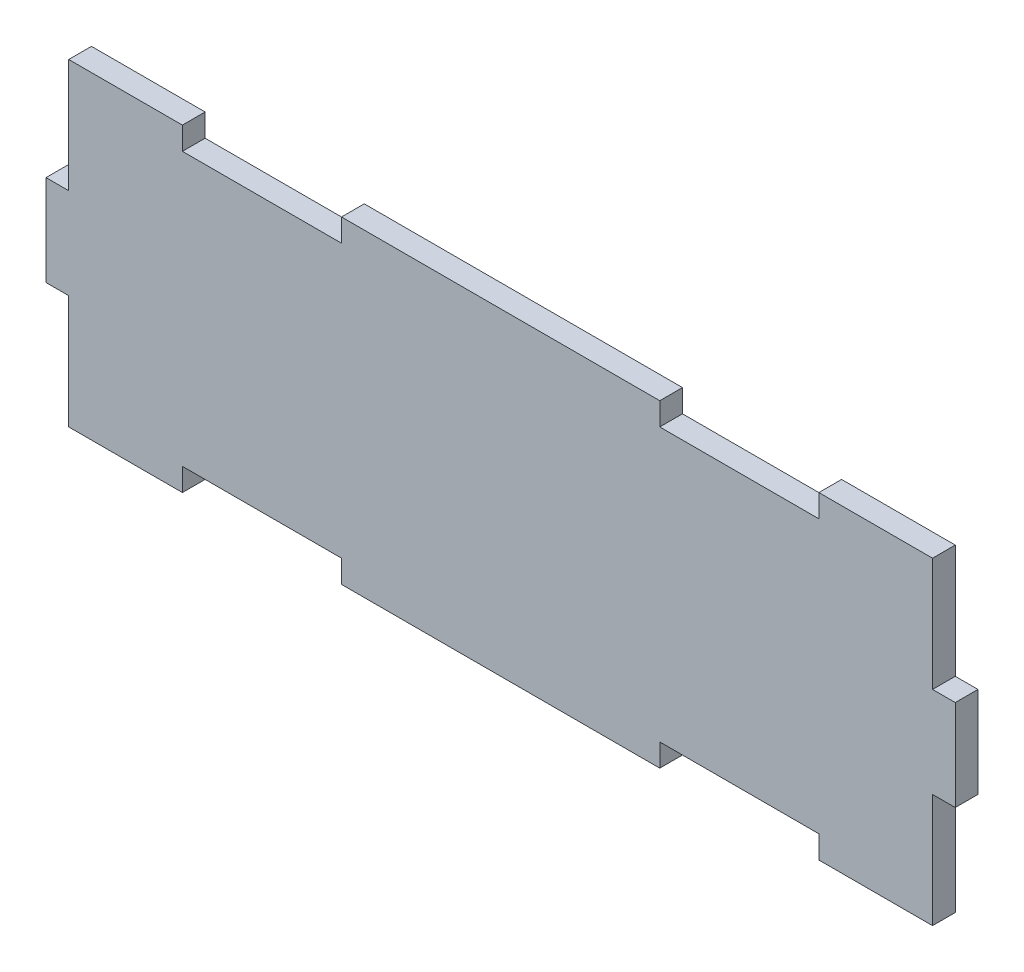
ISO-10303-21;
HEADER;
FILE_DESCRIPTION(('STEP AP214'),'2;1');
FILE_NAME('part.step','',(''),(''),'','','');
FILE_SCHEMA(('AUTOMOTIVE_DESIGN { 1 0 10303 214 1 1 1 1 }'));
ENDSEC;
DATA;
#1=APPLICATION_CONTEXT('core data for automotive mechanical design processes');
#2=APPLICATION_PROTOCOL_DEFINITION('international standard','automotive_design',2000,#1);
#3=PRODUCT_CONTEXT('',#1,'mechanical');
#4=PRODUCT('Part','Part','',(#3));
#5=PRODUCT_RELATED_PRODUCT_CATEGORY('part','',(#4));
#6=PRODUCT_DEFINITION_FORMATION('','',#4);
#7=PRODUCT_DEFINITION_CONTEXT('part definition',#1,'design');
#8=PRODUCT_DEFINITION('design','',#6,#7);
#9=PRODUCT_DEFINITION_SHAPE('','',#8);
#10=(LENGTH_UNIT() NAMED_UNIT(*) SI_UNIT(.MILLI.,.METRE.));
#11=(NAMED_UNIT(*) PLANE_ANGLE_UNIT() SI_UNIT($,.RADIAN.));
#12=(NAMED_UNIT(*) SI_UNIT($,.STERADIAN.) SOLID_ANGLE_UNIT());
#13=UNCERTAINTY_MEASURE_WITH_UNIT(LENGTH_MEASURE(1.E-05),#10,'distance_accuracy_value','');
#14=(GEOMETRIC_REPRESENTATION_CONTEXT(3) GLOBAL_UNCERTAINTY_ASSIGNED_CONTEXT((#13)) GLOBAL_UNIT_ASSIGNED_CONTEXT((#10,
#11,#12)) REPRESENTATION_CONTEXT('',''));
#15=CARTESIAN_POINT('',(0.,0.,0.));
#16=DIRECTION('',(0.,0.,1.));
#17=DIRECTION('',(1.,0.,0.));
#18=AXIS2_PLACEMENT_3D('',#15,#16,#17);
#19=CARTESIAN_POINT('',(21.953781512605,55.6932773109244,5.));
#20=DIRECTION('',(-1.,0.,0.));
#21=DIRECTION('',(0.,0.,1.));
#22=AXIS2_PLACEMENT_3D('',#19,#20,#21);
#23=PLANE('',#22);
#24=DIRECTION('',(0.,1.,0.));
#25=VECTOR('',#24,1.);
#26=CARTESIAN_POINT('',(21.953781512605,55.6932773109244,0.));
#27=LINE('',#26,#25);
#28=CARTESIAN_POINT('',(21.953781512605,50.6932773109244,0.));
#29=VERTEX_POINT('',#28);
#30=CARTESIAN_POINT('',(21.953781512605,55.6932773109244,0.));
#31=VERTEX_POINT('',#30);
#32=EDGE_CURVE('E248',#29,#31,#27,.T.);
#33=ORIENTED_EDGE('',*,*,#32,.T.);
#34=DIRECTION('',(0.,0.,-1.));
#35=VECTOR('',#34,1.);
#36=CARTESIAN_POINT('',(21.953781512605,55.6932773109244,5.));
#37=LINE('',#36,#35);
#38=CARTESIAN_POINT('',(21.953781512605,55.6932773109244,5.));
#39=VERTEX_POINT('',#38);
#40=EDGE_CURVE('E11',#39,#31,#37,.T.);
#41=ORIENTED_EDGE('',*,*,#40,.F.);
#42=DIRECTION('',(0.,1.,0.));
#43=VECTOR('',#42,1.);
#44=CARTESIAN_POINT('',(21.953781512605,55.6932773109244,5.));
#45=LINE('',#44,#43);
#46=CARTESIAN_POINT('',(21.953781512605,50.6932773109244,5.));
#47=VERTEX_POINT('',#46);
#48=EDGE_CURVE('E302',#47,#39,#45,.T.);
#49=ORIENTED_EDGE('',*,*,#48,.F.);
#50=DIRECTION('',(0.,0.,-1.));
#51=VECTOR('',#50,1.);
#52=CARTESIAN_POINT('',(21.953781512605,50.6932773109244,5.));
#53=LINE('',#52,#51);
#54=EDGE_CURVE('E244',#47,#29,#53,.T.);
#55=ORIENTED_EDGE('',*,*,#54,.T.);
#56=EDGE_LOOP('',(#33,#41,#49,#55));
#57=FACE_BOUND('',#56,.T.);
#58=ADVANCED_FACE('F32',(#57),#23,.F.);
#59=CARTESIAN_POINT('',(-48.046218487395,55.6932773109244,5.));
#60=DIRECTION('',(0.,-1.,0.));
#61=DIRECTION('',(0.,0.,-1.));
#62=AXIS2_PLACEMENT_3D('',#59,#60,#61);
#63=PLANE('',#62);
#64=DIRECTION('',(-1.,0.,0.));
#65=VECTOR('',#64,1.);
#66=CARTESIAN_POINT('',(-48.046218487395,55.6932773109244,0.));
#67=LINE('',#66,#65);
#68=CARTESIAN_POINT('',(-48.046218487395,55.6932773109244,0.));
#69=VERTEX_POINT('',#68);
#70=EDGE_CURVE('E251',#31,#69,#67,.T.);
#71=ORIENTED_EDGE('',*,*,#70,.T.);
#72=DIRECTION('',(0.,0.,-1.));
#73=VECTOR('',#72,1.);
#74=CARTESIAN_POINT('',(-48.046218487395,55.6932773109244,5.));
#75=LINE('',#74,#73);
#76=CARTESIAN_POINT('',(-48.046218487395,55.6932773109244,5.));
#77=VERTEX_POINT('',#76);
#78=EDGE_CURVE('E40',#77,#69,#75,.T.);
#79=ORIENTED_EDGE('',*,*,#78,.F.);
#80=DIRECTION('',(-1.,0.,0.));
#81=VECTOR('',#80,1.);
#82=CARTESIAN_POINT('',(-48.046218487395,55.6932773109244,5.));
#83=LINE('',#82,#81);
#84=EDGE_CURVE('E151',#39,#77,#83,.T.);
#85=ORIENTED_EDGE('',*,*,#84,.F.);
#86=ORIENTED_EDGE('',*,*,#40,.T.);
#87=EDGE_LOOP('',(#71,#79,#85,#86));
#88=FACE_BOUND('',#87,.T.);
#89=ADVANCED_FACE('F460',(#88),#63,.F.);
#90=CARTESIAN_POINT('',(-48.046218487395,55.6932773109244,5.));
#91=DIRECTION('',(1.,0.,0.));
#92=DIRECTION('',(0.,0.,-1.));
#93=AXIS2_PLACEMENT_3D('',#90,#91,#92);
#94=PLANE('',#93);
#95=DIRECTION('',(0.,-1.,0.));
#96=VECTOR('',#95,1.);
#97=CARTESIAN_POINT('',(-48.046218487395,55.6932773109244,0.));
#98=LINE('',#97,#96);
#99=CARTESIAN_POINT('',(-48.046218487395,50.6932773109244,0.));
#100=VERTEX_POINT('',#99);
#101=EDGE_CURVE('E253',#69,#100,#98,.T.);
#102=ORIENTED_EDGE('',*,*,#101,.T.);
#103=DIRECTION('',(0.,0.,-1.));
#104=VECTOR('',#103,1.);
#105=CARTESIAN_POINT('',(-48.046218487395,50.6932773109244,5.));
#106=LINE('',#105,#104);
#107=CARTESIAN_POINT('',(-48.046218487395,50.6932773109244,5.));
#108=VERTEX_POINT('',#107);
#109=EDGE_CURVE('E369',#108,#100,#106,.T.);
#110=ORIENTED_EDGE('',*,*,#109,.F.);
#111=DIRECTION('',(0.,-1.,0.));
#112=VECTOR('',#111,1.);
#113=CARTESIAN_POINT('',(-48.046218487395,55.6932773109244,5.));
#114=LINE('',#113,#112);
#115=EDGE_CURVE('E377',#77,#108,#114,.T.);
#116=ORIENTED_EDGE('',*,*,#115,.F.);
#117=ORIENTED_EDGE('',*,*,#78,.T.);
#118=EDGE_LOOP('',(#102,#110,#116,#117));
#119=FACE_BOUND('',#118,.T.);
#120=ADVANCED_FACE('F375',(#119),#94,.F.);
#121=CARTESIAN_POINT('',(-48.046218487395,50.6932773109244,5.));
#122=DIRECTION('',(0.,-1.,0.));
#123=DIRECTION('',(0.,0.,-1.));
#124=AXIS2_PLACEMENT_3D('',#121,#122,#123);
#125=PLANE('',#124);
#126=DIRECTION('',(-1.,0.,0.));
#127=VECTOR('',#126,1.);
#128=CARTESIAN_POINT('',(-48.046218487395,50.6932773109244,0.));
#129=LINE('',#128,#127);
#130=CARTESIAN_POINT('',(-83.046218487395,50.6932773109244,0.));
#131=VERTEX_POINT('',#130);
#132=EDGE_CURVE('E255',#100,#131,#129,.T.);
#133=ORIENTED_EDGE('',*,*,#132,.T.);
#134=DIRECTION('',(0.,0.,-1.));
#135=VECTOR('',#134,1.);
#136=CARTESIAN_POINT('',(-83.046218487395,50.6932773109244,5.));
#137=LINE('',#136,#135);
#138=CARTESIAN_POINT('',(-83.046218487395,50.6932773109244,5.));
#139=VERTEX_POINT('',#138);
#140=EDGE_CURVE('E366',#139,#131,#137,.T.);
#141=ORIENTED_EDGE('',*,*,#140,.F.);
#142=DIRECTION('',(-1.,0.,0.));
#143=VECTOR('',#142,1.);
#144=CARTESIAN_POINT('',(-48.046218487395,50.6932773109244,5.));
#145=LINE('',#144,#143);
#146=EDGE_CURVE('E395',#108,#139,#145,.T.);
#147=ORIENTED_EDGE('',*,*,#146,.F.);
#148=ORIENTED_EDGE('',*,*,#109,.T.);
#149=EDGE_LOOP('',(#133,#141,#147,#148));
#150=FACE_BOUND('',#149,.T.);
#151=ADVANCED_FACE('F386',(#150),#125,.F.);
#152=CARTESIAN_POINT('',(-83.046218487395,50.6932773109244,5.));
#153=DIRECTION('',(-1.,0.,0.));
#154=DIRECTION('',(0.,0.,1.));
#155=AXIS2_PLACEMENT_3D('',#152,#153,#154);
#156=PLANE('',#155);
#157=DIRECTION('',(0.,1.,0.));
#158=VECTOR('',#157,1.);
#159=CARTESIAN_POINT('',(-83.046218487395,50.6932773109244,0.));
#160=LINE('',#159,#158);
#161=CARTESIAN_POINT('',(-83.046218487395,55.6932773109244,0.));
#162=VERTEX_POINT('',#161);
#163=EDGE_CURVE('E257',#131,#162,#160,.T.);
#164=ORIENTED_EDGE('',*,*,#163,.T.);
#165=DIRECTION('',(0.,0.,-1.));
#166=VECTOR('',#165,1.);
#167=CARTESIAN_POINT('',(-83.046218487395,55.6932773109244,5.));
#168=LINE('',#167,#166);
#169=CARTESIAN_POINT('',(-83.046218487395,55.6932773109244,5.));
#170=VERTEX_POINT('',#169);
#171=EDGE_CURVE('E363',#170,#162,#168,.T.);
#172=ORIENTED_EDGE('',*,*,#171,.F.);
#173=DIRECTION('',(0.,1.,0.));
#174=VECTOR('',#173,1.);
#175=CARTESIAN_POINT('',(-83.046218487395,50.6932773109244,5.));
#176=LINE('',#175,#174);
#177=EDGE_CURVE('E392',#139,#170,#176,.T.);
#178=ORIENTED_EDGE('',*,*,#177,.F.);
#179=ORIENTED_EDGE('',*,*,#140,.T.);
#180=EDGE_LOOP('',(#164,#172,#178,#179));
#181=FACE_BOUND('',#180,.T.);
#182=ADVANCED_FACE('F390',(#181),#156,.F.);
#183=CARTESIAN_POINT('',(-83.046218487395,55.6932773109244,5.));
#184=DIRECTION('',(0.,-1.,0.));
#185=DIRECTION('',(0.,0.,-1.));
#186=AXIS2_PLACEMENT_3D('',#183,#184,#185);
#187=PLANE('',#186);
#188=DIRECTION('',(-1.,0.,0.));
#189=VECTOR('',#188,1.);
#190=CARTESIAN_POINT('',(-83.046218487395,55.6932773109244,0.));
#191=LINE('',#190,#189);
#192=CARTESIAN_POINT('',(-108.046218487395,55.6932773109244,0.));
#193=VERTEX_POINT('',#192);
#194=EDGE_CURVE('E259',#162,#193,#191,.T.);
#195=ORIENTED_EDGE('',*,*,#194,.T.);
#196=DIRECTION('',(0.,0.,-1.));
#197=VECTOR('',#196,1.);
#198=CARTESIAN_POINT('',(-108.046218487395,55.6932773109244,5.));
#199=LINE('',#198,#197);
#200=CARTESIAN_POINT('',(-108.046218487395,55.6932773109244,5.));
#201=VERTEX_POINT('',#200);
#202=EDGE_CURVE('E360',#201,#193,#199,.T.);
#203=ORIENTED_EDGE('',*,*,#202,.F.);
#204=DIRECTION('',(-1.,0.,0.));
#205=VECTOR('',#204,1.);
#206=CARTESIAN_POINT('',(-83.046218487395,55.6932773109244,5.));
#207=LINE('',#206,#205);
#208=EDGE_CURVE('E394',#170,#201,#207,.T.);
#209=ORIENTED_EDGE('',*,*,#208,.F.);
#210=ORIENTED_EDGE('',*,*,#171,.T.);
#211=EDGE_LOOP('',(#195,#203,#209,#210));
#212=FACE_BOUND('',#211,.T.);
#213=ADVANCED_FACE('F473',(#212),#187,.F.);
#214=CARTESIAN_POINT('',(-108.046218487395,55.6932773109244,5.));
#215=DIRECTION('',(1.,0.,0.));
#216=DIRECTION('',(0.,0.,-1.));
#217=AXIS2_PLACEMENT_3D('',#214,#215,#216);
#218=PLANE('',#217);
#219=DIRECTION('',(0.,-1.,0.));
#220=VECTOR('',#219,1.);
#221=CARTESIAN_POINT('',(-108.046218487395,55.6932773109244,0.));
#222=LINE('',#221,#220);
#223=CARTESIAN_POINT('',(-108.046218487395,30.6932773109244,0.));
#224=VERTEX_POINT('',#223);
#225=EDGE_CURVE('E261',#193,#224,#222,.T.);
#226=ORIENTED_EDGE('',*,*,#225,.T.);
#227=DIRECTION('',(0.,0.,-1.));
#228=VECTOR('',#227,1.);
#229=CARTESIAN_POINT('',(-108.046218487395,30.6932773109244,5.));
#230=LINE('',#229,#228);
#231=CARTESIAN_POINT('',(-108.046218487395,30.6932773109244,5.));
#232=VERTEX_POINT('',#231);
#233=EDGE_CURVE('E357',#232,#224,#230,.T.);
#234=ORIENTED_EDGE('',*,*,#233,.F.);
#235=DIRECTION('',(0.,-1.,0.));
#236=VECTOR('',#235,1.);
#237=CARTESIAN_POINT('',(-108.046218487395,55.6932773109244,5.));
#238=LINE('',#237,#236);
#239=EDGE_CURVE('E397',#201,#232,#238,.T.);
#240=ORIENTED_EDGE('',*,*,#239,.F.);
#241=ORIENTED_EDGE('',*,*,#202,.T.);
#242=EDGE_LOOP('',(#226,#234,#240,#241));
#243=FACE_BOUND('',#242,.T.);
#244=ADVANCED_FACE('F476',(#243),#218,.F.);
#245=CARTESIAN_POINT('',(-108.046218487395,30.6932773109244,5.));
#246=DIRECTION('',(0.,-1.,0.));
#247=DIRECTION('',(0.,0.,-1.));
#248=AXIS2_PLACEMENT_3D('',#245,#246,#247);
#249=PLANE('',#248);
#250=DIRECTION('',(-1.,0.,0.));
#251=VECTOR('',#250,1.);
#252=CARTESIAN_POINT('',(-108.046218487395,30.6932773109244,0.));
#253=LINE('',#252,#251);
#254=CARTESIAN_POINT('',(-113.046218487395,30.6932773109244,0.));
#255=VERTEX_POINT('',#254);
#256=EDGE_CURVE('E263',#224,#255,#253,.T.);
#257=ORIENTED_EDGE('',*,*,#256,.T.);
#258=DIRECTION('',(0.,0.,-1.));
#259=VECTOR('',#258,1.);
#260=CARTESIAN_POINT('',(-113.046218487395,30.6932773109244,5.));
#261=LINE('',#260,#259);
#262=CARTESIAN_POINT('',(-113.046218487395,30.6932773109244,5.));
#263=VERTEX_POINT('',#262);
#264=EDGE_CURVE('E354',#263,#255,#261,.T.);
#265=ORIENTED_EDGE('',*,*,#264,.F.);
#266=DIRECTION('',(-1.,0.,0.));
#267=VECTOR('',#266,1.);
#268=CARTESIAN_POINT('',(-108.046218487395,30.6932773109244,5.));
#269=LINE('',#268,#267);
#270=EDGE_CURVE('E403',#232,#263,#269,.T.);
#271=ORIENTED_EDGE('',*,*,#270,.F.);
#272=ORIENTED_EDGE('',*,*,#233,.T.);
#273=EDGE_LOOP('',(#257,#265,#271,#272));
#274=FACE_BOUND('',#273,.T.);
#275=ADVANCED_FACE('F480',(#274),#249,.F.);
#276=CARTESIAN_POINT('',(-113.046218487395,30.6932773109244,5.));
#277=DIRECTION('',(1.,0.,0.));
#278=DIRECTION('',(0.,1.,0.));
#279=AXIS2_PLACEMENT_3D('',#276,#277,#278);
#280=PLANE('',#279);
#281=DIRECTION('',(0.,-1.,0.));
#282=VECTOR('',#281,1.);
#283=CARTESIAN_POINT('',(-113.046218487395,30.6932773109244,0.));
#284=LINE('',#283,#282);
#285=CARTESIAN_POINT('',(-113.046218487395,10.6932773109243,0.));
#286=VERTEX_POINT('',#285);
#287=EDGE_CURVE('E265',#255,#286,#284,.T.);
#288=ORIENTED_EDGE('',*,*,#287,.T.);
#289=DIRECTION('',(0.,0.,-1.));
#290=VECTOR('',#289,1.);
#291=CARTESIAN_POINT('',(-113.046218487395,10.6932773109243,5.));
#292=LINE('',#291,#290);
#293=CARTESIAN_POINT('',(-113.046218487395,10.6932773109243,5.));
#294=VERTEX_POINT('',#293);
#295=EDGE_CURVE('E351',#294,#286,#292,.T.);
#296=ORIENTED_EDGE('',*,*,#295,.F.);
#297=DIRECTION('',(0.,-1.,0.));
#298=VECTOR('',#297,1.);
#299=CARTESIAN_POINT('',(-113.046218487395,30.6932773109244,5.));
#300=LINE('',#299,#298);
#301=EDGE_CURVE('E405',#263,#294,#300,.T.);
#302=ORIENTED_EDGE('',*,*,#301,.F.);
#303=ORIENTED_EDGE('',*,*,#264,.T.);
#304=EDGE_LOOP('',(#288,#296,#302,#303));
#305=FACE_BOUND('',#304,.T.);
#306=ADVANCED_FACE('F484',(#305),#280,.F.);
#307=CARTESIAN_POINT('',(-108.046218487395,10.6932773109243,5.));
#308=DIRECTION('',(0.,1.,0.));
#309=DIRECTION('',(0.,0.,1.));
#310=AXIS2_PLACEMENT_3D('',#307,#308,#309);
#311=PLANE('',#310);
#312=DIRECTION('',(1.,0.,0.));
#313=VECTOR('',#312,1.);
#314=CARTESIAN_POINT('',(-108.046218487395,10.6932773109243,0.));
#315=LINE('',#314,#313);
#316=CARTESIAN_POINT('',(-108.046218487395,10.6932773109243,0.));
#317=VERTEX_POINT('',#316);
#318=EDGE_CURVE('E267',#286,#317,#315,.T.);
#319=ORIENTED_EDGE('',*,*,#318,.T.);
#320=DIRECTION('',(0.,0.,-1.));
#321=VECTOR('',#320,1.);
#322=CARTESIAN_POINT('',(-108.046218487395,10.6932773109243,5.));
#323=LINE('',#322,#321);
#324=CARTESIAN_POINT('',(-108.046218487395,10.6932773109243,5.));
#325=VERTEX_POINT('',#324);
#326=EDGE_CURVE('E348',#325,#317,#323,.T.);
#327=ORIENTED_EDGE('',*,*,#326,.F.);
#328=DIRECTION('',(1.,0.,0.));
#329=VECTOR('',#328,1.);
#330=CARTESIAN_POINT('',(-108.046218487395,10.6932773109243,5.));
#331=LINE('',#330,#329);
#332=EDGE_CURVE('E407',#294,#325,#331,.T.);
#333=ORIENTED_EDGE('',*,*,#332,.F.);
#334=ORIENTED_EDGE('',*,*,#295,.T.);
#335=EDGE_LOOP('',(#319,#327,#333,#334));
#336=FACE_BOUND('',#335,.T.);
#337=ADVANCED_FACE('F488',(#336),#311,.F.);
#338=CARTESIAN_POINT('',(-108.046218487395,-14.3067226890757,5.));
#339=DIRECTION('',(1.,0.,0.));
#340=DIRECTION('',(0.,0.,-1.));
#341=AXIS2_PLACEMENT_3D('',#338,#339,#340);
#342=PLANE('',#341);
#343=DIRECTION('',(0.,-1.,0.));
#344=VECTOR('',#343,1.);
#345=CARTESIAN_POINT('',(-108.046218487395,-14.3067226890757,0.));
#346=LINE('',#345,#344);
#347=CARTESIAN_POINT('',(-108.046218487395,-14.3067226890757,0.));
#348=VERTEX_POINT('',#347);
#349=EDGE_CURVE('E269',#317,#348,#346,.T.);
#350=ORIENTED_EDGE('',*,*,#349,.T.);
#351=DIRECTION('',(0.,0.,-1.));
#352=VECTOR('',#351,1.);
#353=CARTESIAN_POINT('',(-108.046218487395,-14.3067226890757,5.));
#354=LINE('',#353,#352);
#355=CARTESIAN_POINT('',(-108.046218487395,-14.3067226890757,5.));
#356=VERTEX_POINT('',#355);
#357=EDGE_CURVE('E345',#356,#348,#354,.T.);
#358=ORIENTED_EDGE('',*,*,#357,.F.);
#359=DIRECTION('',(0.,-1.,0.));
#360=VECTOR('',#359,1.);
#361=CARTESIAN_POINT('',(-108.046218487395,-14.3067226890757,5.));
#362=LINE('',#361,#360);
#363=EDGE_CURVE('E409',#325,#356,#362,.T.);
#364=ORIENTED_EDGE('',*,*,#363,.F.);
#365=ORIENTED_EDGE('',*,*,#326,.T.);
#366=EDGE_LOOP('',(#350,#358,#364,#365));
#367=FACE_BOUND('',#366,.T.);
#368=ADVANCED_FACE('F492',(#367),#342,.F.);
#369=CARTESIAN_POINT('',(-83.0462184873949,-14.3067226890757,5.));
#370=DIRECTION('',(0.,1.,0.));
#371=DIRECTION('',(0.,0.,1.));
#372=AXIS2_PLACEMENT_3D('',#369,#370,#371);
#373=PLANE('',#372);
#374=DIRECTION('',(1.,0.,0.));
#375=VECTOR('',#374,1.);
#376=CARTESIAN_POINT('',(-83.0462184873949,-14.3067226890757,0.));
#377=LINE('',#376,#375);
#378=CARTESIAN_POINT('',(-83.0462184873949,-14.3067226890757,0.));
#379=VERTEX_POINT('',#378);
#380=EDGE_CURVE('E271',#348,#379,#377,.T.);
#381=ORIENTED_EDGE('',*,*,#380,.T.);
#382=DIRECTION('',(0.,0.,-1.));
#383=VECTOR('',#382,1.);
#384=CARTESIAN_POINT('',(-83.0462184873949,-14.3067226890757,5.));
#385=LINE('',#384,#383);
#386=CARTESIAN_POINT('',(-83.0462184873949,-14.3067226890757,5.));
#387=VERTEX_POINT('',#386);
#388=EDGE_CURVE('E342',#387,#379,#385,.T.);
#389=ORIENTED_EDGE('',*,*,#388,.F.);
#390=DIRECTION('',(1.,0.,0.));
#391=VECTOR('',#390,1.);
#392=CARTESIAN_POINT('',(-83.0462184873949,-14.3067226890757,5.));
#393=LINE('',#392,#391);
#394=EDGE_CURVE('E411',#356,#387,#393,.T.);
#395=ORIENTED_EDGE('',*,*,#394,.F.);
#396=ORIENTED_EDGE('',*,*,#357,.T.);
#397=EDGE_LOOP('',(#381,#389,#395,#396));
#398=FACE_BOUND('',#397,.T.);
#399=ADVANCED_FACE('F496',(#398),#373,.F.);
#400=CARTESIAN_POINT('',(-83.0462184873949,-9.30672268907565,5.));
#401=DIRECTION('',(-1.,0.,0.));
#402=DIRECTION('',(0.,0.,1.));
#403=AXIS2_PLACEMENT_3D('',#400,#401,#402);
#404=PLANE('',#403);
#405=DIRECTION('',(0.,1.,0.));
#406=VECTOR('',#405,1.);
#407=CARTESIAN_POINT('',(-83.0462184873949,-9.30672268907565,0.));
#408=LINE('',#407,#406);
#409=CARTESIAN_POINT('',(-83.0462184873949,-9.30672268907565,0.));
#410=VERTEX_POINT('',#409);
#411=EDGE_CURVE('E273',#379,#410,#408,.T.);
#412=ORIENTED_EDGE('',*,*,#411,.T.);
#413=DIRECTION('',(0.,0.,-1.));
#414=VECTOR('',#413,1.);
#415=CARTESIAN_POINT('',(-83.0462184873949,-9.30672268907565,5.));
#416=LINE('',#415,#414);
#417=CARTESIAN_POINT('',(-83.0462184873949,-9.30672268907565,5.));
#418=VERTEX_POINT('',#417);
#419=EDGE_CURVE('E339',#418,#410,#416,.T.);
#420=ORIENTED_EDGE('',*,*,#419,.F.);
#421=DIRECTION('',(0.,1.,0.));
#422=VECTOR('',#421,1.);
#423=CARTESIAN_POINT('',(-83.0462184873949,-9.30672268907565,5.));
#424=LINE('',#423,#422);
#425=EDGE_CURVE('E413',#387,#418,#424,.T.);
#426=ORIENTED_EDGE('',*,*,#425,.F.);
#427=ORIENTED_EDGE('',*,*,#388,.T.);
#428=EDGE_LOOP('',(#412,#420,#426,#427));
#429=FACE_BOUND('',#428,.T.);
#430=ADVANCED_FACE('F500',(#429),#404,.F.);
#431=CARTESIAN_POINT('',(-48.0462184873949,-9.30672268907565,5.));
#432=DIRECTION('',(0.,1.,0.));
#433=DIRECTION('',(0.,0.,1.));
#434=AXIS2_PLACEMENT_3D('',#431,#432,#433);
#435=PLANE('',#434);
#436=DIRECTION('',(1.,0.,0.));
#437=VECTOR('',#436,1.);
#438=CARTESIAN_POINT('',(-48.0462184873949,-9.30672268907565,0.));
#439=LINE('',#438,#437);
#440=CARTESIAN_POINT('',(-48.0462184873949,-9.30672268907565,0.));
#441=VERTEX_POINT('',#440);
#442=EDGE_CURVE('E275',#410,#441,#439,.T.);
#443=ORIENTED_EDGE('',*,*,#442,.T.);
#444=DIRECTION('',(0.,0.,-1.));
#445=VECTOR('',#444,1.);
#446=CARTESIAN_POINT('',(-48.0462184873949,-9.30672268907565,5.));
#447=LINE('',#446,#445);
#448=CARTESIAN_POINT('',(-48.0462184873949,-9.30672268907565,5.));
#449=VERTEX_POINT('',#448);
#450=EDGE_CURVE('E336',#449,#441,#447,.T.);
#451=ORIENTED_EDGE('',*,*,#450,.F.);
#452=DIRECTION('',(1.,0.,0.));
#453=VECTOR('',#452,1.);
#454=CARTESIAN_POINT('',(-48.0462184873949,-9.30672268907565,5.));
#455=LINE('',#454,#453);
#456=EDGE_CURVE('E415',#418,#449,#455,.T.);
#457=ORIENTED_EDGE('',*,*,#456,.F.);
#458=ORIENTED_EDGE('',*,*,#419,.T.);
#459=EDGE_LOOP('',(#443,#451,#457,#458));
#460=FACE_BOUND('',#459,.T.);
#461=ADVANCED_FACE('F504',(#460),#435,.F.);
#462=CARTESIAN_POINT('',(-48.0462184873949,-14.3067226890757,5.));
#463=DIRECTION('',(1.,0.,0.));
#464=DIRECTION('',(0.,0.,-1.));
#465=AXIS2_PLACEMENT_3D('',#462,#463,#464);
#466=PLANE('',#465);
#467=DIRECTION('',(0.,-1.,0.));
#468=VECTOR('',#467,1.);
#469=CARTESIAN_POINT('',(-48.0462184873949,-14.3067226890757,0.));
#470=LINE('',#469,#468);
#471=CARTESIAN_POINT('',(-48.0462184873949,-14.3067226890757,0.));
#472=VERTEX_POINT('',#471);
#473=EDGE_CURVE('E277',#441,#472,#470,.T.);
#474=ORIENTED_EDGE('',*,*,#473,.T.);
#475=DIRECTION('',(0.,0.,-1.));
#476=VECTOR('',#475,1.);
#477=CARTESIAN_POINT('',(-48.0462184873949,-14.3067226890757,5.));
#478=LINE('',#477,#476);
#479=CARTESIAN_POINT('',(-48.0462184873949,-14.3067226890757,5.));
#480=VERTEX_POINT('',#479);
#481=EDGE_CURVE('E333',#480,#472,#478,.T.);
#482=ORIENTED_EDGE('',*,*,#481,.F.);
#483=DIRECTION('',(0.,-1.,0.));
#484=VECTOR('',#483,1.);
#485=CARTESIAN_POINT('',(-48.0462184873949,-14.3067226890757,5.));
#486=LINE('',#485,#484);
#487=EDGE_CURVE('E417',#449,#480,#486,.T.);
#488=ORIENTED_EDGE('',*,*,#487,.F.);
#489=ORIENTED_EDGE('',*,*,#450,.T.);
#490=EDGE_LOOP('',(#474,#482,#488,#489));
#491=FACE_BOUND('',#490,.T.);
#492=ADVANCED_FACE('F508',(#491),#466,.F.);
#493=CARTESIAN_POINT('',(-48.0462184873949,-14.3067226890757,5.));
#494=DIRECTION('',(0.,1.,0.));
#495=DIRECTION('',(0.,0.,1.));
#496=AXIS2_PLACEMENT_3D('',#493,#494,#495);
#497=PLANE('',#496);
#498=DIRECTION('',(1.,0.,0.));
#499=VECTOR('',#498,1.);
#500=CARTESIAN_POINT('',(-48.0462184873949,-14.3067226890757,0.));
#501=LINE('',#500,#499);
#502=CARTESIAN_POINT('',(21.953781512605,-14.3067226890757,0.));
#503=VERTEX_POINT('',#502);
#504=EDGE_CURVE('E279',#472,#503,#501,.T.);
#505=ORIENTED_EDGE('',*,*,#504,.T.);
#506=DIRECTION('',(0.,0.,-1.));
#507=VECTOR('',#506,1.);
#508=CARTESIAN_POINT('',(21.953781512605,-14.3067226890757,5.));
#509=LINE('',#508,#507);
#510=CARTESIAN_POINT('',(21.953781512605,-14.3067226890757,5.));
#511=VERTEX_POINT('',#510);
#512=EDGE_CURVE('E330',#511,#503,#509,.T.);
#513=ORIENTED_EDGE('',*,*,#512,.F.);
#514=DIRECTION('',(1.,0.,0.));
#515=VECTOR('',#514,1.);
#516=CARTESIAN_POINT('',(-48.0462184873949,-14.3067226890757,5.));
#517=LINE('',#516,#515);
#518=EDGE_CURVE('E419',#480,#511,#517,.T.);
#519=ORIENTED_EDGE('',*,*,#518,.F.);
#520=ORIENTED_EDGE('',*,*,#481,.T.);
#521=EDGE_LOOP('',(#505,#513,#519,#520));
#522=FACE_BOUND('',#521,.T.);
#523=ADVANCED_FACE('F512',(#522),#497,.F.);
#524=CARTESIAN_POINT('',(21.953781512605,-14.3067226890757,5.));
#525=DIRECTION('',(-1.,0.,0.));
#526=DIRECTION('',(0.,0.,1.));
#527=AXIS2_PLACEMENT_3D('',#524,#525,#526);
#528=PLANE('',#527);
#529=DIRECTION('',(0.,1.,0.));
#530=VECTOR('',#529,1.);
#531=CARTESIAN_POINT('',(21.953781512605,-14.3067226890757,0.));
#532=LINE('',#531,#530);
#533=CARTESIAN_POINT('',(21.953781512605,-9.30672268907565,0.));
#534=VERTEX_POINT('',#533);
#535=EDGE_CURVE('E281',#503,#534,#532,.T.);
#536=ORIENTED_EDGE('',*,*,#535,.T.);
#537=DIRECTION('',(0.,0.,-1.));
#538=VECTOR('',#537,1.);
#539=CARTESIAN_POINT('',(21.953781512605,-9.30672268907565,5.));
#540=LINE('',#539,#538);
#541=CARTESIAN_POINT('',(21.953781512605,-9.30672268907565,5.));
#542=VERTEX_POINT('',#541);
#543=EDGE_CURVE('E327',#542,#534,#540,.T.);
#544=ORIENTED_EDGE('',*,*,#543,.F.);
#545=DIRECTION('',(0.,1.,0.));
#546=VECTOR('',#545,1.);
#547=CARTESIAN_POINT('',(21.953781512605,-14.3067226890757,5.));
#548=LINE('',#547,#546);
#549=EDGE_CURVE('E421',#511,#542,#548,.T.);
#550=ORIENTED_EDGE('',*,*,#549,.F.);
#551=ORIENTED_EDGE('',*,*,#512,.T.);
#552=EDGE_LOOP('',(#536,#544,#550,#551));
#553=FACE_BOUND('',#552,.T.);
#554=ADVANCED_FACE('F516',(#553),#528,.F.);
#555=CARTESIAN_POINT('',(21.953781512605,-9.30672268907565,5.));
#556=DIRECTION('',(0.,1.,0.));
#557=DIRECTION('',(0.,0.,1.));
#558=AXIS2_PLACEMENT_3D('',#555,#556,#557);
#559=PLANE('',#558);
#560=DIRECTION('',(1.,0.,0.));
#561=VECTOR('',#560,1.);
#562=CARTESIAN_POINT('',(21.953781512605,-9.30672268907565,0.));
#563=LINE('',#562,#561);
#564=CARTESIAN_POINT('',(56.953781512605,-9.30672268907565,0.));
#565=VERTEX_POINT('',#564);
#566=EDGE_CURVE('E283',#534,#565,#563,.T.);
#567=ORIENTED_EDGE('',*,*,#566,.T.);
#568=DIRECTION('',(0.,0.,-1.));
#569=VECTOR('',#568,1.);
#570=CARTESIAN_POINT('',(56.953781512605,-9.30672268907565,5.));
#571=LINE('',#570,#569);
#572=CARTESIAN_POINT('',(56.953781512605,-9.30672268907565,5.));
#573=VERTEX_POINT('',#572);
#574=EDGE_CURVE('E324',#573,#565,#571,.T.);
#575=ORIENTED_EDGE('',*,*,#574,.F.);
#576=DIRECTION('',(1.,0.,0.));
#577=VECTOR('',#576,1.);
#578=CARTESIAN_POINT('',(21.953781512605,-9.30672268907565,5.));
#579=LINE('',#578,#577);
#580=EDGE_CURVE('E423',#542,#573,#579,.T.);
#581=ORIENTED_EDGE('',*,*,#580,.F.);
#582=ORIENTED_EDGE('',*,*,#543,.T.);
#583=EDGE_LOOP('',(#567,#575,#581,#582));
#584=FACE_BOUND('',#583,.T.);
#585=ADVANCED_FACE('F520',(#584),#559,.F.);
#586=CARTESIAN_POINT('',(56.953781512605,-9.30672268907565,5.));
#587=DIRECTION('',(1.,0.,0.));
#588=DIRECTION('',(0.,0.,-1.));
#589=AXIS2_PLACEMENT_3D('',#586,#587,#588);
#590=PLANE('',#589);
#591=DIRECTION('',(0.,-1.,0.));
#592=VECTOR('',#591,1.);
#593=CARTESIAN_POINT('',(56.953781512605,-9.30672268907565,0.));
#594=LINE('',#593,#592);
#595=CARTESIAN_POINT('',(56.953781512605,-14.3067226890757,0.));
#596=VERTEX_POINT('',#595);
#597=EDGE_CURVE('E285',#565,#596,#594,.T.);
#598=ORIENTED_EDGE('',*,*,#597,.T.);
#599=DIRECTION('',(0.,0.,-1.));
#600=VECTOR('',#599,1.);
#601=CARTESIAN_POINT('',(56.953781512605,-14.3067226890757,5.));
#602=LINE('',#601,#600);
#603=CARTESIAN_POINT('',(56.953781512605,-14.3067226890757,5.));
#604=VERTEX_POINT('',#603);
#605=EDGE_CURVE('E321',#604,#596,#602,.T.);
#606=ORIENTED_EDGE('',*,*,#605,.F.);
#607=DIRECTION('',(0.,-1.,0.));
#608=VECTOR('',#607,1.);
#609=CARTESIAN_POINT('',(56.953781512605,-9.30672268907565,5.));
#610=LINE('',#609,#608);
#611=EDGE_CURVE('E425',#573,#604,#610,.T.);
#612=ORIENTED_EDGE('',*,*,#611,.F.);
#613=ORIENTED_EDGE('',*,*,#574,.T.);
#614=EDGE_LOOP('',(#598,#606,#612,#613));
#615=FACE_BOUND('',#614,.T.);
#616=ADVANCED_FACE('F524',(#615),#590,.F.);
#617=CARTESIAN_POINT('',(56.953781512605,-14.3067226890757,5.));
#618=DIRECTION('',(0.,1.,0.));
#619=DIRECTION('',(0.,0.,1.));
#620=AXIS2_PLACEMENT_3D('',#617,#618,#619);
#621=PLANE('',#620);
#622=DIRECTION('',(1.,0.,0.));
#623=VECTOR('',#622,1.);
#624=CARTESIAN_POINT('',(56.953781512605,-14.3067226890757,0.));
#625=LINE('',#624,#623);
#626=CARTESIAN_POINT('',(81.953781512605,-14.3067226890757,0.));
#627=VERTEX_POINT('',#626);
#628=EDGE_CURVE('E287',#596,#627,#625,.T.);
#629=ORIENTED_EDGE('',*,*,#628,.T.);
#630=DIRECTION('',(0.,0.,-1.));
#631=VECTOR('',#630,1.);
#632=CARTESIAN_POINT('',(81.953781512605,-14.3067226890757,5.));
#633=LINE('',#632,#631);
#634=CARTESIAN_POINT('',(81.953781512605,-14.3067226890757,5.));
#635=VERTEX_POINT('',#634);
#636=EDGE_CURVE('E318',#635,#627,#633,.T.);
#637=ORIENTED_EDGE('',*,*,#636,.F.);
#638=DIRECTION('',(1.,0.,0.));
#639=VECTOR('',#638,1.);
#640=CARTESIAN_POINT('',(56.953781512605,-14.3067226890757,5.));
#641=LINE('',#640,#639);
#642=EDGE_CURVE('E427',#604,#635,#641,.T.);
#643=ORIENTED_EDGE('',*,*,#642,.F.);
#644=ORIENTED_EDGE('',*,*,#605,.T.);
#645=EDGE_LOOP('',(#629,#637,#643,#644));
#646=FACE_BOUND('',#645,.T.);
#647=ADVANCED_FACE('F528',(#646),#621,.F.);
#648=CARTESIAN_POINT('',(81.953781512605,-14.3067226890757,5.));
#649=DIRECTION('',(-1.,0.,0.));
#650=DIRECTION('',(0.,0.,1.));
#651=AXIS2_PLACEMENT_3D('',#648,#649,#650);
#652=PLANE('',#651);
#653=DIRECTION('',(0.,1.,0.));
#654=VECTOR('',#653,1.);
#655=CARTESIAN_POINT('',(81.953781512605,-14.3067226890757,0.));
#656=LINE('',#655,#654);
#657=CARTESIAN_POINT('',(81.953781512605,10.6932773109243,0.));
#658=VERTEX_POINT('',#657);
#659=EDGE_CURVE('E289',#627,#658,#656,.T.);
#660=ORIENTED_EDGE('',*,*,#659,.T.);
#661=DIRECTION('',(0.,0.,-1.));
#662=VECTOR('',#661,1.);
#663=CARTESIAN_POINT('',(81.953781512605,10.6932773109243,5.));
#664=LINE('',#663,#662);
#665=CARTESIAN_POINT('',(81.953781512605,10.6932773109243,5.));
#666=VERTEX_POINT('',#665);
#667=EDGE_CURVE('E315',#666,#658,#664,.T.);
#668=ORIENTED_EDGE('',*,*,#667,.F.);
#669=DIRECTION('',(0.,1.,0.));
#670=VECTOR('',#669,1.);
#671=CARTESIAN_POINT('',(81.953781512605,-14.3067226890757,5.));
#672=LINE('',#671,#670);
#673=EDGE_CURVE('E429',#635,#666,#672,.T.);
#674=ORIENTED_EDGE('',*,*,#673,.F.);
#675=ORIENTED_EDGE('',*,*,#636,.T.);
#676=EDGE_LOOP('',(#660,#668,#674,#675));
#677=FACE_BOUND('',#676,.T.);
#678=ADVANCED_FACE('F532',(#677),#652,.F.);
#679=CARTESIAN_POINT('',(81.953781512605,10.6932773109243,5.));
#680=DIRECTION('',(0.,1.,0.));
#681=DIRECTION('',(0.,0.,1.));
#682=AXIS2_PLACEMENT_3D('',#679,#680,#681);
#683=PLANE('',#682);
#684=DIRECTION('',(1.,0.,0.));
#685=VECTOR('',#684,1.);
#686=CARTESIAN_POINT('',(81.953781512605,10.6932773109243,0.));
#687=LINE('',#686,#685);
#688=CARTESIAN_POINT('',(86.953781512605,10.6932773109243,0.));
#689=VERTEX_POINT('',#688);
#690=EDGE_CURVE('E291',#658,#689,#687,.T.);
#691=ORIENTED_EDGE('',*,*,#690,.T.);
#692=DIRECTION('',(0.,0.,-1.));
#693=VECTOR('',#692,1.);
#694=CARTESIAN_POINT('',(86.953781512605,10.6932773109243,5.));
#695=LINE('',#694,#693);
#696=CARTESIAN_POINT('',(86.953781512605,10.6932773109243,5.));
#697=VERTEX_POINT('',#696);
#698=EDGE_CURVE('E312',#697,#689,#695,.T.);
#699=ORIENTED_EDGE('',*,*,#698,.F.);
#700=DIRECTION('',(1.,0.,0.));
#701=VECTOR('',#700,1.);
#702=CARTESIAN_POINT('',(81.953781512605,10.6932773109243,5.));
#703=LINE('',#702,#701);
#704=EDGE_CURVE('E431',#666,#697,#703,.T.);
#705=ORIENTED_EDGE('',*,*,#704,.F.);
#706=ORIENTED_EDGE('',*,*,#667,.T.);
#707=EDGE_LOOP('',(#691,#699,#705,#706));
#708=FACE_BOUND('',#707,.T.);
#709=ADVANCED_FACE('F536',(#708),#683,.F.);
#710=CARTESIAN_POINT('',(86.953781512605,30.6932773109244,5.));
#711=DIRECTION('',(-1.,0.,0.));
#712=DIRECTION('',(0.,-1.,0.));
#713=AXIS2_PLACEMENT_3D('',#710,#711,#712);
#714=PLANE('',#713);
#715=DIRECTION('',(0.,1.,0.));
#716=VECTOR('',#715,1.);
#717=CARTESIAN_POINT('',(86.953781512605,30.6932773109244,0.));
#718=LINE('',#717,#716);
#719=CARTESIAN_POINT('',(86.953781512605,30.6932773109244,0.));
#720=VERTEX_POINT('',#719);
#721=EDGE_CURVE('E293',#689,#720,#718,.T.);
#722=ORIENTED_EDGE('',*,*,#721,.T.);
#723=DIRECTION('',(0.,0.,-1.));
#724=VECTOR('',#723,1.);
#725=CARTESIAN_POINT('',(86.953781512605,30.6932773109244,5.));
#726=LINE('',#725,#724);
#727=CARTESIAN_POINT('',(86.953781512605,30.6932773109244,5.));
#728=VERTEX_POINT('',#727);
#729=EDGE_CURVE('E309',#728,#720,#726,.T.);
#730=ORIENTED_EDGE('',*,*,#729,.F.);
#731=DIRECTION('',(0.,1.,0.));
#732=VECTOR('',#731,1.);
#733=CARTESIAN_POINT('',(86.953781512605,30.6932773109244,5.));
#734=LINE('',#733,#732);
#735=EDGE_CURVE('E433',#697,#728,#734,.T.);
#736=ORIENTED_EDGE('',*,*,#735,.F.);
#737=ORIENTED_EDGE('',*,*,#698,.T.);
#738=EDGE_LOOP('',(#722,#730,#736,#737));
#739=FACE_BOUND('',#738,.T.);
#740=ADVANCED_FACE('F540',(#739),#714,.F.);
#741=CARTESIAN_POINT('',(81.953781512605,30.6932773109244,5.));
#742=DIRECTION('',(0.,-1.,0.));
#743=DIRECTION('',(0.,0.,-1.));
#744=AXIS2_PLACEMENT_3D('',#741,#742,#743);
#745=PLANE('',#744);
#746=DIRECTION('',(-1.,0.,0.));
#747=VECTOR('',#746,1.);
#748=CARTESIAN_POINT('',(81.953781512605,30.6932773109244,0.));
#749=LINE('',#748,#747);
#750=CARTESIAN_POINT('',(81.953781512605,30.6932773109244,0.));
#751=VERTEX_POINT('',#750);
#752=EDGE_CURVE('E295',#720,#751,#749,.T.);
#753=ORIENTED_EDGE('',*,*,#752,.T.);
#754=DIRECTION('',(0.,0.,-1.));
#755=VECTOR('',#754,1.);
#756=CARTESIAN_POINT('',(81.953781512605,30.6932773109244,5.));
#757=LINE('',#756,#755);
#758=CARTESIAN_POINT('',(81.953781512605,30.6932773109244,5.));
#759=VERTEX_POINT('',#758);
#760=EDGE_CURVE('E306',#759,#751,#757,.T.);
#761=ORIENTED_EDGE('',*,*,#760,.F.);
#762=DIRECTION('',(-1.,0.,0.));
#763=VECTOR('',#762,1.);
#764=CARTESIAN_POINT('',(81.953781512605,30.6932773109244,5.));
#765=LINE('',#764,#763);
#766=EDGE_CURVE('E435',#728,#759,#765,.T.);
#767=ORIENTED_EDGE('',*,*,#766,.F.);
#768=ORIENTED_EDGE('',*,*,#729,.T.);
#769=EDGE_LOOP('',(#753,#761,#767,#768));
#770=FACE_BOUND('',#769,.T.);
#771=ADVANCED_FACE('F441',(#770),#745,.F.);
#772=CARTESIAN_POINT('',(81.953781512605,55.6932773109244,5.));
#773=DIRECTION('',(-1.,0.,0.));
#774=DIRECTION('',(0.,0.,1.));
#775=AXIS2_PLACEMENT_3D('',#772,#773,#774);
#776=PLANE('',#775);
#777=DIRECTION('',(0.,1.,0.));
#778=VECTOR('',#777,1.);
#779=CARTESIAN_POINT('',(81.953781512605,55.6932773109244,0.));
#780=LINE('',#779,#778);
#781=CARTESIAN_POINT('',(81.953781512605,55.6932773109244,0.));
#782=VERTEX_POINT('',#781);
#783=EDGE_CURVE('E297',#751,#782,#780,.T.);
#784=ORIENTED_EDGE('',*,*,#783,.T.);
#785=DIRECTION('',(0.,0.,-1.));
#786=VECTOR('',#785,1.);
#787=CARTESIAN_POINT('',(81.953781512605,55.6932773109244,5.));
#788=LINE('',#787,#786);
#789=CARTESIAN_POINT('',(81.953781512605,55.6932773109244,5.));
#790=VERTEX_POINT('',#789);
#791=EDGE_CURVE('E239',#790,#782,#788,.T.);
#792=ORIENTED_EDGE('',*,*,#791,.F.);
#793=DIRECTION('',(0.,1.,0.));
#794=VECTOR('',#793,1.);
#795=CARTESIAN_POINT('',(81.953781512605,55.6932773109244,5.));
#796=LINE('',#795,#794);
#797=EDGE_CURVE('E230',#759,#790,#796,.T.);
#798=ORIENTED_EDGE('',*,*,#797,.F.);
#799=ORIENTED_EDGE('',*,*,#760,.T.);
#800=EDGE_LOOP('',(#784,#792,#798,#799));
#801=FACE_BOUND('',#800,.T.);
#802=ADVANCED_FACE('F445',(#801),#776,.F.);
#803=CARTESIAN_POINT('',(56.953781512605,55.6932773109244,5.));
#804=DIRECTION('',(0.,-1.,0.));
#805=DIRECTION('',(0.,0.,-1.));
#806=AXIS2_PLACEMENT_3D('',#803,#804,#805);
#807=PLANE('',#806);
#808=DIRECTION('',(-1.,0.,0.));
#809=VECTOR('',#808,1.);
#810=CARTESIAN_POINT('',(56.953781512605,55.6932773109244,0.));
#811=LINE('',#810,#809);
#812=CARTESIAN_POINT('',(56.953781512605,55.6932773109244,0.));
#813=VERTEX_POINT('',#812);
#814=EDGE_CURVE('E238',#782,#813,#811,.T.);
#815=ORIENTED_EDGE('',*,*,#814,.T.);
#816=DIRECTION('',(0.,0.,-1.));
#817=VECTOR('',#816,1.);
#818=CARTESIAN_POINT('',(56.953781512605,55.6932773109244,5.));
#819=LINE('',#818,#817);
#820=CARTESIAN_POINT('',(56.953781512605,55.6932773109244,5.));
#821=VERTEX_POINT('',#820);
#822=EDGE_CURVE('E235',#821,#813,#819,.T.);
#823=ORIENTED_EDGE('',*,*,#822,.F.);
#824=DIRECTION('',(-1.,0.,0.));
#825=VECTOR('',#824,1.);
#826=CARTESIAN_POINT('',(56.953781512605,55.6932773109244,5.));
#827=LINE('',#826,#825);
#828=EDGE_CURVE('E224',#790,#821,#827,.T.);
#829=ORIENTED_EDGE('',*,*,#828,.F.);
#830=ORIENTED_EDGE('',*,*,#791,.T.);
#831=EDGE_LOOP('',(#815,#823,#829,#830));
#832=FACE_BOUND('',#831,.T.);
#833=ADVANCED_FACE('F236',(#832),#807,.F.);
#834=CARTESIAN_POINT('',(56.953781512605,50.6932773109244,5.));
#835=DIRECTION('',(1.,0.,0.));
#836=DIRECTION('',(0.,0.,-1.));
#837=AXIS2_PLACEMENT_3D('',#834,#835,#836);
#838=PLANE('',#837);
#839=DIRECTION('',(0.,-1.,0.));
#840=VECTOR('',#839,1.);
#841=CARTESIAN_POINT('',(56.953781512605,50.6932773109244,0.));
#842=LINE('',#841,#840);
#843=CARTESIAN_POINT('',(56.953781512605,50.6932773109244,0.));
#844=VERTEX_POINT('',#843);
#845=EDGE_CURVE('E137',#813,#844,#842,.T.);
#846=ORIENTED_EDGE('',*,*,#845,.T.);
#847=DIRECTION('',(0.,0.,-1.));
#848=VECTOR('',#847,1.);
#849=CARTESIAN_POINT('',(56.953781512605,50.6932773109244,5.));
#850=LINE('',#849,#848);
#851=CARTESIAN_POINT('',(56.953781512605,50.6932773109244,5.));
#852=VERTEX_POINT('',#851);
#853=EDGE_CURVE('E240',#852,#844,#850,.T.);
#854=ORIENTED_EDGE('',*,*,#853,.F.);
#855=DIRECTION('',(0.,-1.,0.));
#856=VECTOR('',#855,1.);
#857=CARTESIAN_POINT('',(56.953781512605,50.6932773109244,5.));
#858=LINE('',#857,#856);
#859=EDGE_CURVE('E228',#821,#852,#858,.T.);
#860=ORIENTED_EDGE('',*,*,#859,.F.);
#861=ORIENTED_EDGE('',*,*,#822,.T.);
#862=EDGE_LOOP('',(#846,#854,#860,#861));
#863=FACE_BOUND('',#862,.T.);
#864=ADVANCED_FACE('F242',(#863),#838,.F.);
#865=CARTESIAN_POINT('',(21.953781512605,50.6932773109244,5.));
#866=DIRECTION('',(0.,-1.,0.));
#867=DIRECTION('',(0.,0.,-1.));
#868=AXIS2_PLACEMENT_3D('',#865,#866,#867);
#869=PLANE('',#868);
#870=DIRECTION('',(-1.,0.,0.));
#871=VECTOR('',#870,1.);
#872=CARTESIAN_POINT('',(21.953781512605,50.6932773109244,0.));
#873=LINE('',#872,#871);
#874=EDGE_CURVE('E143',#844,#29,#873,.T.);
#875=ORIENTED_EDGE('',*,*,#874,.T.);
#876=ORIENTED_EDGE('',*,*,#54,.F.);
#877=DIRECTION('',(-1.,0.,0.));
#878=VECTOR('',#877,1.);
#879=CARTESIAN_POINT('',(21.953781512605,50.6932773109244,5.));
#880=LINE('',#879,#878);
#881=EDGE_CURVE('E48',#852,#47,#880,.T.);
#882=ORIENTED_EDGE('',*,*,#881,.F.);
#883=ORIENTED_EDGE('',*,*,#853,.T.);
#884=EDGE_LOOP('',(#875,#876,#882,#883));
#885=FACE_BOUND('',#884,.T.);
#886=ADVANCED_FACE('F449',(#885),#869,.F.);
#887=CARTESIAN_POINT('',(0.,0.,5.));
#888=DIRECTION('',(0.,0.,1.));
#889=DIRECTION('',(1.,0.,0.));
#890=AXIS2_PLACEMENT_3D('',#887,#888,#889);
#891=PLANE('',#890);
#892=ORIENTED_EDGE('',*,*,#48,.T.);
#893=ORIENTED_EDGE('',*,*,#84,.T.);
#894=ORIENTED_EDGE('',*,*,#115,.T.);
#895=ORIENTED_EDGE('',*,*,#146,.T.);
#896=ORIENTED_EDGE('',*,*,#177,.T.);
#897=ORIENTED_EDGE('',*,*,#208,.T.);
#898=ORIENTED_EDGE('',*,*,#239,.T.);
#899=ORIENTED_EDGE('',*,*,#270,.T.);
#900=ORIENTED_EDGE('',*,*,#301,.T.);
#901=ORIENTED_EDGE('',*,*,#332,.T.);
#902=ORIENTED_EDGE('',*,*,#363,.T.);
#903=ORIENTED_EDGE('',*,*,#394,.T.);
#904=ORIENTED_EDGE('',*,*,#425,.T.);
#905=ORIENTED_EDGE('',*,*,#456,.T.);
#906=ORIENTED_EDGE('',*,*,#487,.T.);
#907=ORIENTED_EDGE('',*,*,#518,.T.);
#908=ORIENTED_EDGE('',*,*,#549,.T.);
#909=ORIENTED_EDGE('',*,*,#580,.T.);
#910=ORIENTED_EDGE('',*,*,#611,.T.);
#911=ORIENTED_EDGE('',*,*,#642,.T.);
#912=ORIENTED_EDGE('',*,*,#673,.T.);
#913=ORIENTED_EDGE('',*,*,#704,.T.);
#914=ORIENTED_EDGE('',*,*,#735,.T.);
#915=ORIENTED_EDGE('',*,*,#766,.T.);
#916=ORIENTED_EDGE('',*,*,#797,.T.);
#917=ORIENTED_EDGE('',*,*,#828,.T.);
#918=ORIENTED_EDGE('',*,*,#859,.T.);
#919=ORIENTED_EDGE('',*,*,#881,.T.);
#920=EDGE_LOOP('',(#892,#893,#894,#895,#896,#897,#898,#899,#900,#901,#902,#903,#904,#905,#906,
#907,#908,#909,#910,#911,#912,#913,#914,#915,#916,#917,#918,#919));
#921=FACE_BOUND('',#920,.T.);
#922=ADVANCED_FACE('F226',(#921),#891,.T.);
#923=CARTESIAN_POINT('',(0.,0.,0.));
#924=DIRECTION('',(0.,0.,1.));
#925=DIRECTION('',(1.,0.,0.));
#926=AXIS2_PLACEMENT_3D('',#923,#924,#925);
#927=PLANE('',#926);
#928=ORIENTED_EDGE('',*,*,#32,.F.);
#929=ORIENTED_EDGE('',*,*,#874,.F.);
#930=ORIENTED_EDGE('',*,*,#845,.F.);
#931=ORIENTED_EDGE('',*,*,#814,.F.);
#932=ORIENTED_EDGE('',*,*,#783,.F.);
#933=ORIENTED_EDGE('',*,*,#752,.F.);
#934=ORIENTED_EDGE('',*,*,#721,.F.);
#935=ORIENTED_EDGE('',*,*,#690,.F.);
#936=ORIENTED_EDGE('',*,*,#659,.F.);
#937=ORIENTED_EDGE('',*,*,#628,.F.);
#938=ORIENTED_EDGE('',*,*,#597,.F.);
#939=ORIENTED_EDGE('',*,*,#566,.F.);
#940=ORIENTED_EDGE('',*,*,#535,.F.);
#941=ORIENTED_EDGE('',*,*,#504,.F.);
#942=ORIENTED_EDGE('',*,*,#473,.F.);
#943=ORIENTED_EDGE('',*,*,#442,.F.);
#944=ORIENTED_EDGE('',*,*,#411,.F.);
#945=ORIENTED_EDGE('',*,*,#380,.F.);
#946=ORIENTED_EDGE('',*,*,#349,.F.);
#947=ORIENTED_EDGE('',*,*,#318,.F.);
#948=ORIENTED_EDGE('',*,*,#287,.F.);
#949=ORIENTED_EDGE('',*,*,#256,.F.);
#950=ORIENTED_EDGE('',*,*,#225,.F.);
#951=ORIENTED_EDGE('',*,*,#194,.F.);
#952=ORIENTED_EDGE('',*,*,#163,.F.);
#953=ORIENTED_EDGE('',*,*,#132,.F.);
#954=ORIENTED_EDGE('',*,*,#101,.F.);
#955=ORIENTED_EDGE('',*,*,#70,.F.);
#956=EDGE_LOOP('',(#928,#929,#930,#931,#932,#933,#934,#935,#936,#937,#938,#939,#940,#941,#942,
#943,#944,#945,#946,#947,#948,#949,#950,#951,#952,#953,#954,#955));
#957=FACE_BOUND('',#956,.T.);
#958=ADVANCED_FACE('F381',(#957),#927,.F.);
#959=CLOSED_SHELL('',(#58,#89,#120,#151,#182,#213,#244,#275,#306,#337,#368,#399,#430,#461,#492,
#523,#554,#585,#616,#647,#678,#709,#740,#771,#802,#833,#864,#886,#922,#958));
#960=MANIFOLD_SOLID_BREP('B2',#959);
#961=ADVANCED_BREP_SHAPE_REPRESENTATION('',(#18,#960),#14);
#962=SHAPE_DEFINITION_REPRESENTATION(#9,#961);
ENDSEC;
END-ISO-10303-21;
